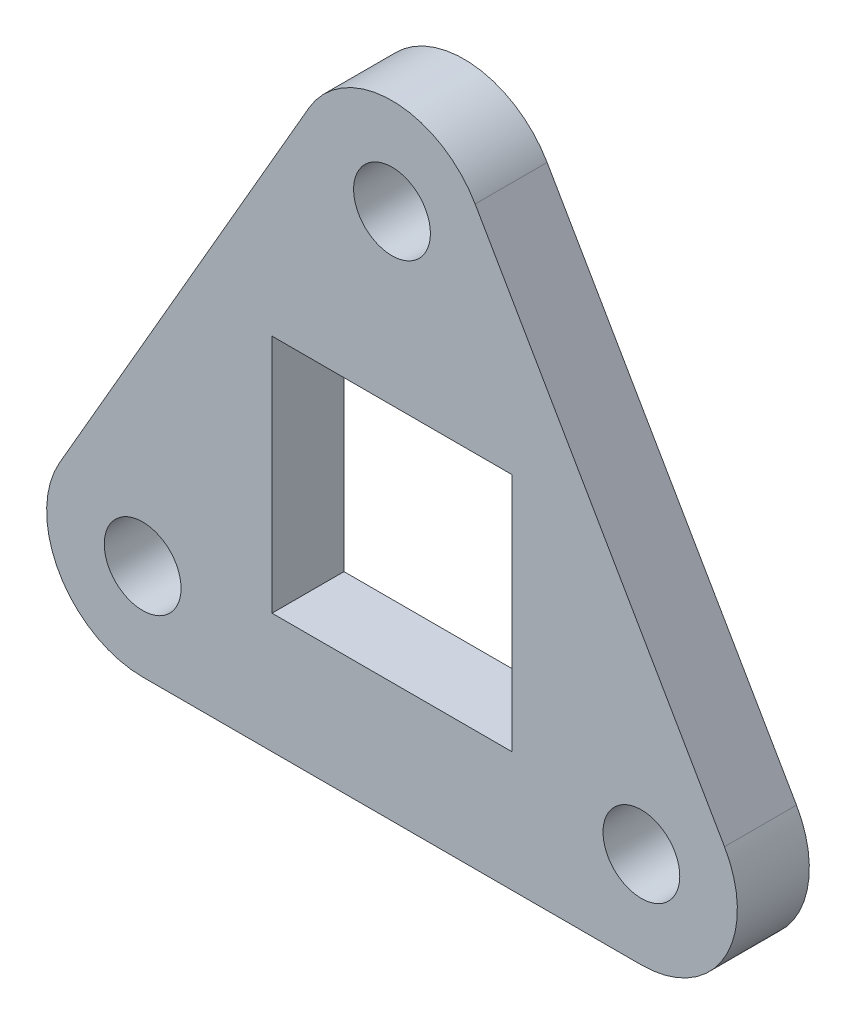
ISO-10303-21;
HEADER;
FILE_DESCRIPTION(('STEP AP214'),'2;1');
FILE_NAME('part.step','',(''),(''),'','','');
FILE_SCHEMA(('AUTOMOTIVE_DESIGN { 1 0 10303 214 1 1 1 1 }'));
ENDSEC;
DATA;
#1=APPLICATION_CONTEXT('core data for automotive mechanical design processes');
#2=APPLICATION_PROTOCOL_DEFINITION('international standard','automotive_design',2000,#1);
#3=PRODUCT_CONTEXT('',#1,'mechanical');
#4=PRODUCT('Part','Part','',(#3));
#5=PRODUCT_RELATED_PRODUCT_CATEGORY('part','',(#4));
#6=PRODUCT_DEFINITION_FORMATION('','',#4);
#7=PRODUCT_DEFINITION_CONTEXT('part definition',#1,'design');
#8=PRODUCT_DEFINITION('design','',#6,#7);
#9=PRODUCT_DEFINITION_SHAPE('','',#8);
#10=(LENGTH_UNIT() NAMED_UNIT(*) SI_UNIT(.MILLI.,.METRE.));
#11=(NAMED_UNIT(*) PLANE_ANGLE_UNIT() SI_UNIT($,.RADIAN.));
#12=(NAMED_UNIT(*) SI_UNIT($,.STERADIAN.) SOLID_ANGLE_UNIT());
#13=UNCERTAINTY_MEASURE_WITH_UNIT(LENGTH_MEASURE(1.E-05),#10,'distance_accuracy_value','');
#14=(GEOMETRIC_REPRESENTATION_CONTEXT(3) GLOBAL_UNCERTAINTY_ASSIGNED_CONTEXT((#13)) GLOBAL_UNIT_ASSIGNED_CONTEXT((#10,
#11,#12)) REPRESENTATION_CONTEXT('',''));
#15=CARTESIAN_POINT('',(0.,0.,0.));
#16=DIRECTION('',(0.,0.,1.));
#17=DIRECTION('',(1.,0.,0.));
#18=AXIS2_PLACEMENT_3D('',#15,#16,#17);
#19=CARTESIAN_POINT('',(0.,12.,3.));
#20=DIRECTION('',(0.,0.,-1.));
#21=DIRECTION('',(-1.,0.,0.));
#22=AXIS2_PLACEMENT_3D('',#19,#20,#21);
#23=PLANE('',#22);
#24=CARTESIAN_POINT('',(0.,12.,3.));
#25=DIRECTION('',(0.,0.,1.));
#26=DIRECTION('',(-1.,0.,0.));
#27=AXIS2_PLACEMENT_3D('',#24,#25,#26);
#28=CIRCLE('',#27,4.);
#29=CARTESIAN_POINT('',(3.46410161513776,14.,3.));
#30=VERTEX_POINT('',#29);
#31=CARTESIAN_POINT('',(-3.46410161513774,14.,3.));
#32=VERTEX_POINT('',#31);
#33=EDGE_CURVE('E149',#30,#32,#28,.T.);
#34=ORIENTED_EDGE('',*,*,#33,.T.);
#35=DIRECTION('',(-0.500000000000004,-0.866025403784436,0.));
#36=VECTOR('',#35,1.);
#37=CARTESIAN_POINT('',(-13.8564064605511,-3.99999999999989,3.));
#38=LINE('',#37,#36);
#39=CARTESIAN_POINT('',(-13.8564064605511,-3.99999999999987,3.));
#40=VERTEX_POINT('',#39);
#41=EDGE_CURVE('E152',#32,#40,#38,.T.);
#42=ORIENTED_EDGE('',*,*,#41,.T.);
#43=CARTESIAN_POINT('',(-10.3923048454133,-5.9999999999999,3.));
#44=DIRECTION('',(0.,0.,1.));
#45=DIRECTION('',(1.,0.,0.));
#46=AXIS2_PLACEMENT_3D('',#43,#44,#45);
#47=CIRCLE('',#46,4.00000000000004);
#48=CARTESIAN_POINT('',(-10.3923048454133,-9.99999999999999,3.));
#49=VERTEX_POINT('',#48);
#50=EDGE_CURVE('E155',#40,#49,#47,.T.);
#51=ORIENTED_EDGE('',*,*,#50,.T.);
#52=DIRECTION('',(1.,0.,0.));
#53=VECTOR('',#52,1.);
#54=CARTESIAN_POINT('',(-10.3923048454133,-9.99999999999999,3.));
#55=LINE('',#54,#53);
#56=CARTESIAN_POINT('',(10.3923048454132,-10.,3.));
#57=VERTEX_POINT('',#56);
#58=EDGE_CURVE('E157',#49,#57,#55,.T.);
#59=ORIENTED_EDGE('',*,*,#58,.T.);
#60=CARTESIAN_POINT('',(10.3923048454132,-6.00000000000005,3.));
#61=DIRECTION('',(0.,0.,1.));
#62=DIRECTION('',(1.,0.,0.));
#63=AXIS2_PLACEMENT_3D('',#60,#61,#62);
#64=CIRCLE('',#63,3.99999999999998);
#65=CARTESIAN_POINT('',(13.856406460551,-4.00000000000006,3.));
#66=VERTEX_POINT('',#65);
#67=EDGE_CURVE('E159',#57,#66,#64,.T.);
#68=ORIENTED_EDGE('',*,*,#67,.T.);
#69=DIRECTION('',(-0.499999999999998,0.86602540378444,0.));
#70=VECTOR('',#69,1.);
#71=CARTESIAN_POINT('',(3.46410161513776,14.,3.));
#72=LINE('',#71,#70);
#73=EDGE_CURVE('E161',#66,#30,#72,.T.);
#74=ORIENTED_EDGE('',*,*,#73,.T.);
#75=EDGE_LOOP('',(#34,#42,#51,#59,#68,#74));
#76=FACE_BOUND('',#75,.T.);
#77=DIRECTION('',(0.,-1.,0.));
#78=VECTOR('',#77,1.);
#79=CARTESIAN_POINT('',(-5.,-5.,3.));
#80=LINE('',#79,#78);
#81=CARTESIAN_POINT('',(-5.,5.,3.));
#82=VERTEX_POINT('',#81);
#83=CARTESIAN_POINT('',(-5.,-5.,3.));
#84=VERTEX_POINT('',#83);
#85=EDGE_CURVE('E110',#82,#84,#80,.T.);
#86=ORIENTED_EDGE('',*,*,#85,.F.);
#87=DIRECTION('',(-1.,0.,0.));
#88=VECTOR('',#87,1.);
#89=CARTESIAN_POINT('',(5.,5.,3.));
#90=LINE('',#89,#88);
#91=CARTESIAN_POINT('',(5.,5.,3.));
#92=VERTEX_POINT('',#91);
#93=EDGE_CURVE('E133',#92,#82,#90,.T.);
#94=ORIENTED_EDGE('',*,*,#93,.F.);
#95=DIRECTION('',(0.,1.,0.));
#96=VECTOR('',#95,1.);
#97=CARTESIAN_POINT('',(5.,-5.,3.));
#98=LINE('',#97,#96);
#99=CARTESIAN_POINT('',(5.,-5.,3.));
#100=VERTEX_POINT('',#99);
#101=EDGE_CURVE('E131',#100,#92,#98,.T.);
#102=ORIENTED_EDGE('',*,*,#101,.F.);
#103=DIRECTION('',(1.,0.,0.));
#104=VECTOR('',#103,1.);
#105=CARTESIAN_POINT('',(5.,-5.,3.));
#106=LINE('',#105,#104);
#107=EDGE_CURVE('E118',#84,#100,#106,.T.);
#108=ORIENTED_EDGE('',*,*,#107,.F.);
#109=EDGE_LOOP('',(#86,#94,#102,#108));
#110=FACE_BOUND('',#109,.T.);
#111=CARTESIAN_POINT('',(0.,12.,3.));
#112=DIRECTION('',(0.,0.,1.));
#113=DIRECTION('',(1.,0.,0.));
#114=AXIS2_PLACEMENT_3D('',#111,#112,#113);
#115=CIRCLE('',#114,1.6);
#116=CARTESIAN_POINT('',(1.6,12.,3.));
#117=VERTEX_POINT('',#116);
#118=EDGE_CURVE('E139',#117,#117,#115,.T.);
#119=ORIENTED_EDGE('',*,*,#118,.F.);
#120=EDGE_LOOP('',(#119));
#121=FACE_BOUND('',#120,.T.);
#122=CARTESIAN_POINT('',(10.3923048454132,-6.00000000000005,3.));
#123=DIRECTION('',(0.,0.,1.));
#124=DIRECTION('',(1.,0.,0.));
#125=AXIS2_PLACEMENT_3D('',#122,#123,#124);
#126=CIRCLE('',#125,1.6);
#127=CARTESIAN_POINT('',(11.9923048454132,-6.00000000000005,3.));
#128=VERTEX_POINT('',#127);
#129=EDGE_CURVE('E267',#128,#128,#126,.T.);
#130=ORIENTED_EDGE('',*,*,#129,.F.);
#131=EDGE_LOOP('',(#130));
#132=FACE_BOUND('',#131,.T.);
#133=CARTESIAN_POINT('',(-10.3923048454133,-5.9999999999999,3.));
#134=DIRECTION('',(0.,0.,1.));
#135=DIRECTION('',(1.,0.,0.));
#136=AXIS2_PLACEMENT_3D('',#133,#134,#135);
#137=CIRCLE('',#136,1.6);
#138=CARTESIAN_POINT('',(-8.79230484541331,-5.9999999999999,3.));
#139=VERTEX_POINT('',#138);
#140=EDGE_CURVE('E258',#139,#139,#137,.T.);
#141=ORIENTED_EDGE('',*,*,#140,.F.);
#142=EDGE_LOOP('',(#141));
#143=FACE_BOUND('',#142,.T.);
#144=ADVANCED_FACE('F33',(#76,#110,#121,#132,#143),#23,.F.);
#145=CARTESIAN_POINT('',(0.,12.,0.));
#146=DIRECTION('',(0.,0.,-1.));
#147=DIRECTION('',(-1.,0.,0.));
#148=AXIS2_PLACEMENT_3D('',#145,#146,#147);
#149=PLANE('',#148);
#150=CARTESIAN_POINT('',(10.3923048454132,-6.00000000000005,0.));
#151=DIRECTION('',(0.,0.,1.));
#152=DIRECTION('',(1.,0.,0.));
#153=AXIS2_PLACEMENT_3D('',#150,#151,#152);
#154=CIRCLE('',#153,1.6);
#155=CARTESIAN_POINT('',(11.9923048454132,-6.00000000000005,0.));
#156=VERTEX_POINT('',#155);
#157=EDGE_CURVE('E264',#156,#156,#154,.T.);
#158=ORIENTED_EDGE('',*,*,#157,.T.);
#159=EDGE_LOOP('',(#158));
#160=FACE_BOUND('',#159,.T.);
#161=DIRECTION('',(-1.,0.,0.));
#162=VECTOR('',#161,1.);
#163=CARTESIAN_POINT('',(5.,5.,0.));
#164=LINE('',#163,#162);
#165=CARTESIAN_POINT('',(5.,5.,0.));
#166=VERTEX_POINT('',#165);
#167=CARTESIAN_POINT('',(-5.,5.,0.));
#168=VERTEX_POINT('',#167);
#169=EDGE_CURVE('E119',#166,#168,#164,.T.);
#170=ORIENTED_EDGE('',*,*,#169,.T.);
#171=DIRECTION('',(0.,-1.,0.));
#172=VECTOR('',#171,1.);
#173=CARTESIAN_POINT('',(-5.,-5.,0.));
#174=LINE('',#173,#172);
#175=CARTESIAN_POINT('',(-5.,-5.,0.));
#176=VERTEX_POINT('',#175);
#177=EDGE_CURVE('E56',#168,#176,#174,.T.);
#178=ORIENTED_EDGE('',*,*,#177,.T.);
#179=DIRECTION('',(1.,0.,0.));
#180=VECTOR('',#179,1.);
#181=CARTESIAN_POINT('',(5.,-5.,0.));
#182=LINE('',#181,#180);
#183=CARTESIAN_POINT('',(5.,-5.,0.));
#184=VERTEX_POINT('',#183);
#185=EDGE_CURVE('E125',#176,#184,#182,.T.);
#186=ORIENTED_EDGE('',*,*,#185,.T.);
#187=DIRECTION('',(0.,1.,0.));
#188=VECTOR('',#187,1.);
#189=CARTESIAN_POINT('',(5.,-5.,0.));
#190=LINE('',#189,#188);
#191=EDGE_CURVE('E141',#184,#166,#190,.T.);
#192=ORIENTED_EDGE('',*,*,#191,.T.);
#193=EDGE_LOOP('',(#170,#178,#186,#192));
#194=FACE_BOUND('',#193,.T.);
#195=CARTESIAN_POINT('',(0.,12.,0.));
#196=DIRECTION('',(0.,0.,1.));
#197=DIRECTION('',(-1.,0.,0.));
#198=AXIS2_PLACEMENT_3D('',#195,#196,#197);
#199=CIRCLE('',#198,4.);
#200=CARTESIAN_POINT('',(3.46410161513776,14.,0.));
#201=VERTEX_POINT('',#200);
#202=CARTESIAN_POINT('',(-3.46410161513774,14.,0.));
#203=VERTEX_POINT('',#202);
#204=EDGE_CURVE('E126',#201,#203,#199,.T.);
#205=ORIENTED_EDGE('',*,*,#204,.F.);
#206=DIRECTION('',(-0.499999999999998,0.86602540378444,0.));
#207=VECTOR('',#206,1.);
#208=CARTESIAN_POINT('',(3.46410161513776,14.,0.));
#209=LINE('',#208,#207);
#210=CARTESIAN_POINT('',(13.856406460551,-4.00000000000006,0.));
#211=VERTEX_POINT('',#210);
#212=EDGE_CURVE('E153',#211,#201,#209,.T.);
#213=ORIENTED_EDGE('',*,*,#212,.F.);
#214=CARTESIAN_POINT('',(10.3923048454132,-6.00000000000005,0.));
#215=DIRECTION('',(0.,0.,1.));
#216=DIRECTION('',(1.,0.,0.));
#217=AXIS2_PLACEMENT_3D('',#214,#215,#216);
#218=CIRCLE('',#217,3.99999999999998);
#219=CARTESIAN_POINT('',(10.3923048454132,-10.,0.));
#220=VERTEX_POINT('',#219);
#221=EDGE_CURVE('E172',#220,#211,#218,.T.);
#222=ORIENTED_EDGE('',*,*,#221,.F.);
#223=DIRECTION('',(1.,0.,0.));
#224=VECTOR('',#223,1.);
#225=CARTESIAN_POINT('',(-10.3923048454133,-9.99999999999999,0.));
#226=LINE('',#225,#224);
#227=CARTESIAN_POINT('',(-10.3923048454133,-9.99999999999999,0.));
#228=VERTEX_POINT('',#227);
#229=EDGE_CURVE('E170',#228,#220,#226,.T.);
#230=ORIENTED_EDGE('',*,*,#229,.F.);
#231=CARTESIAN_POINT('',(-10.3923048454133,-5.9999999999999,0.));
#232=DIRECTION('',(0.,0.,1.));
#233=DIRECTION('',(1.,0.,0.));
#234=AXIS2_PLACEMENT_3D('',#231,#232,#233);
#235=CIRCLE('',#234,4.00000000000004);
#236=CARTESIAN_POINT('',(-13.8564064605511,-3.99999999999987,0.));
#237=VERTEX_POINT('',#236);
#238=EDGE_CURVE('E168',#237,#228,#235,.T.);
#239=ORIENTED_EDGE('',*,*,#238,.F.);
#240=DIRECTION('',(-0.500000000000004,-0.866025403784436,0.));
#241=VECTOR('',#240,1.);
#242=CARTESIAN_POINT('',(-13.8564064605511,-3.99999999999989,0.));
#243=LINE('',#242,#241);
#244=EDGE_CURVE('E166',#203,#237,#243,.T.);
#245=ORIENTED_EDGE('',*,*,#244,.F.);
#246=EDGE_LOOP('',(#205,#213,#222,#230,#239,#245));
#247=FACE_BOUND('',#246,.T.);
#248=CARTESIAN_POINT('',(0.,12.,0.));
#249=DIRECTION('',(0.,0.,1.));
#250=DIRECTION('',(1.,0.,0.));
#251=AXIS2_PLACEMENT_3D('',#248,#249,#250);
#252=CIRCLE('',#251,1.6);
#253=CARTESIAN_POINT('',(1.6,12.,0.));
#254=VERTEX_POINT('',#253);
#255=EDGE_CURVE('E270',#254,#254,#252,.T.);
#256=ORIENTED_EDGE('',*,*,#255,.T.);
#257=EDGE_LOOP('',(#256));
#258=FACE_BOUND('',#257,.T.);
#259=CARTESIAN_POINT('',(-10.3923048454133,-5.9999999999999,0.));
#260=DIRECTION('',(0.,0.,1.));
#261=DIRECTION('',(1.,0.,0.));
#262=AXIS2_PLACEMENT_3D('',#259,#260,#261);
#263=CIRCLE('',#262,1.6);
#264=CARTESIAN_POINT('',(-8.79230484541331,-5.9999999999999,0.));
#265=VERTEX_POINT('',#264);
#266=EDGE_CURVE('E261',#265,#265,#263,.T.);
#267=ORIENTED_EDGE('',*,*,#266,.T.);
#268=EDGE_LOOP('',(#267));
#269=FACE_BOUND('',#268,.T.);
#270=ADVANCED_FACE('F196',(#160,#194,#247,#258,#269),#149,.T.);
#271=CARTESIAN_POINT('',(0.,12.,3.));
#272=DIRECTION('',(0.,0.,-1.));
#273=DIRECTION('',(-1.,0.,0.));
#274=AXIS2_PLACEMENT_3D('',#271,#272,#273);
#275=CYLINDRICAL_SURFACE('',#274,4.);
#276=ORIENTED_EDGE('',*,*,#204,.T.);
#277=DIRECTION('',(0.,0.,-1.));
#278=VECTOR('',#277,1.);
#279=CARTESIAN_POINT('',(-3.46410161513774,14.,3.));
#280=LINE('',#279,#278);
#281=EDGE_CURVE('E11',#32,#203,#280,.T.);
#282=ORIENTED_EDGE('',*,*,#281,.F.);
#283=ORIENTED_EDGE('',*,*,#33,.F.);
#284=DIRECTION('',(0.,0.,-1.));
#285=VECTOR('',#284,1.);
#286=CARTESIAN_POINT('',(3.46410161513776,14.,3.));
#287=LINE('',#286,#285);
#288=EDGE_CURVE('E163',#30,#201,#287,.T.);
#289=ORIENTED_EDGE('',*,*,#288,.T.);
#290=EDGE_LOOP('',(#276,#282,#283,#289));
#291=FACE_BOUND('',#290,.T.);
#292=ADVANCED_FACE('F35',(#291),#275,.T.);
#293=CARTESIAN_POINT('',(-13.8564064605511,-3.99999999999989,3.));
#294=DIRECTION('',(0.866025403784436,-0.500000000000004,0.));
#295=DIRECTION('',(0.500000000000004,0.866025403784437,0.));
#296=AXIS2_PLACEMENT_3D('',#293,#294,#295);
#297=PLANE('',#296);
#298=ORIENTED_EDGE('',*,*,#244,.T.);
#299=DIRECTION('',(0.,0.,-1.));
#300=VECTOR('',#299,1.);
#301=CARTESIAN_POINT('',(-13.8564064605511,-3.99999999999987,3.));
#302=LINE('',#301,#300);
#303=EDGE_CURVE('E41',#40,#237,#302,.T.);
#304=ORIENTED_EDGE('',*,*,#303,.F.);
#305=ORIENTED_EDGE('',*,*,#41,.F.);
#306=ORIENTED_EDGE('',*,*,#281,.T.);
#307=EDGE_LOOP('',(#298,#304,#305,#306));
#308=FACE_BOUND('',#307,.T.);
#309=ADVANCED_FACE('F213',(#308),#297,.F.);
#310=CARTESIAN_POINT('',(-10.3923048454133,-5.9999999999999,3.));
#311=DIRECTION('',(0.,0.,-1.));
#312=DIRECTION('',(-1.,0.,0.));
#313=AXIS2_PLACEMENT_3D('',#310,#311,#312);
#314=CYLINDRICAL_SURFACE('',#313,4.00000000000004);
#315=ORIENTED_EDGE('',*,*,#238,.T.);
#316=DIRECTION('',(0.,0.,-1.));
#317=VECTOR('',#316,1.);
#318=CARTESIAN_POINT('',(-10.3923048454133,-9.99999999999999,3.));
#319=LINE('',#318,#317);
#320=EDGE_CURVE('E183',#49,#228,#319,.T.);
#321=ORIENTED_EDGE('',*,*,#320,.F.);
#322=ORIENTED_EDGE('',*,*,#50,.F.);
#323=ORIENTED_EDGE('',*,*,#303,.T.);
#324=EDGE_LOOP('',(#315,#321,#322,#323));
#325=FACE_BOUND('',#324,.T.);
#326=ADVANCED_FACE('F190',(#325),#314,.T.);
#327=CARTESIAN_POINT('',(-10.3923048454133,-9.99999999999999,3.));
#328=DIRECTION('',(0.,1.,0.));
#329=DIRECTION('',(-1.,0.,0.));
#330=AXIS2_PLACEMENT_3D('',#327,#328,#329);
#331=PLANE('',#330);
#332=ORIENTED_EDGE('',*,*,#229,.T.);
#333=DIRECTION('',(0.,0.,-1.));
#334=VECTOR('',#333,1.);
#335=CARTESIAN_POINT('',(10.3923048454132,-10.,3.));
#336=LINE('',#335,#334);
#337=EDGE_CURVE('E180',#57,#220,#336,.T.);
#338=ORIENTED_EDGE('',*,*,#337,.F.);
#339=ORIENTED_EDGE('',*,*,#58,.F.);
#340=ORIENTED_EDGE('',*,*,#320,.T.);
#341=EDGE_LOOP('',(#332,#338,#339,#340));
#342=FACE_BOUND('',#341,.T.);
#343=ADVANCED_FACE('F202',(#342),#331,.F.);
#344=CARTESIAN_POINT('',(10.3923048454132,-6.00000000000005,3.));
#345=DIRECTION('',(0.,0.,-1.));
#346=DIRECTION('',(-1.,0.,0.));
#347=AXIS2_PLACEMENT_3D('',#344,#345,#346);
#348=CYLINDRICAL_SURFACE('',#347,3.99999999999998);
#349=ORIENTED_EDGE('',*,*,#221,.T.);
#350=DIRECTION('',(0.,0.,-1.));
#351=VECTOR('',#350,1.);
#352=CARTESIAN_POINT('',(13.856406460551,-4.00000000000006,3.));
#353=LINE('',#352,#351);
#354=EDGE_CURVE('E177',#66,#211,#353,.T.);
#355=ORIENTED_EDGE('',*,*,#354,.F.);
#356=ORIENTED_EDGE('',*,*,#67,.F.);
#357=ORIENTED_EDGE('',*,*,#337,.T.);
#358=EDGE_LOOP('',(#349,#355,#356,#357));
#359=FACE_BOUND('',#358,.T.);
#360=ADVANCED_FACE('F206',(#359),#348,.T.);
#361=CARTESIAN_POINT('',(3.46410161513776,14.,3.));
#362=DIRECTION('',(-0.86602540378444,-0.499999999999998,0.));
#363=DIRECTION('',(0.499999999999998,-0.86602540378444,0.));
#364=AXIS2_PLACEMENT_3D('',#361,#362,#363);
#365=PLANE('',#364);
#366=ORIENTED_EDGE('',*,*,#212,.T.);
#367=ORIENTED_EDGE('',*,*,#288,.F.);
#368=ORIENTED_EDGE('',*,*,#73,.F.);
#369=ORIENTED_EDGE('',*,*,#354,.T.);
#370=EDGE_LOOP('',(#366,#367,#368,#369));
#371=FACE_BOUND('',#370,.T.);
#372=ADVANCED_FACE('F216',(#371),#365,.F.);
#373=CARTESIAN_POINT('',(-5.,-5.,3.));
#374=DIRECTION('',(1.,0.,0.));
#375=DIRECTION('',(0.,0.,-1.));
#376=AXIS2_PLACEMENT_3D('',#373,#374,#375);
#377=PLANE('',#376);
#378=ORIENTED_EDGE('',*,*,#177,.F.);
#379=DIRECTION('',(0.,0.,-1.));
#380=VECTOR('',#379,1.);
#381=CARTESIAN_POINT('',(-5.,5.,3.));
#382=LINE('',#381,#380);
#383=EDGE_CURVE('E114',#82,#168,#382,.T.);
#384=ORIENTED_EDGE('',*,*,#383,.F.);
#385=ORIENTED_EDGE('',*,*,#85,.T.);
#386=DIRECTION('',(0.,0.,-1.));
#387=VECTOR('',#386,1.);
#388=CARTESIAN_POINT('',(-5.,-5.,3.));
#389=LINE('',#388,#387);
#390=EDGE_CURVE('E113',#84,#176,#389,.T.);
#391=ORIENTED_EDGE('',*,*,#390,.T.);
#392=EDGE_LOOP('',(#378,#384,#385,#391));
#393=FACE_BOUND('',#392,.T.);
#394=ADVANCED_FACE('F112',(#393),#377,.T.);
#395=CARTESIAN_POINT('',(5.,-5.,3.));
#396=DIRECTION('',(0.,1.,0.));
#397=DIRECTION('',(-1.,0.,0.));
#398=AXIS2_PLACEMENT_3D('',#395,#396,#397);
#399=PLANE('',#398);
#400=ORIENTED_EDGE('',*,*,#185,.F.);
#401=ORIENTED_EDGE('',*,*,#390,.F.);
#402=ORIENTED_EDGE('',*,*,#107,.T.);
#403=DIRECTION('',(0.,0.,-1.));
#404=VECTOR('',#403,1.);
#405=CARTESIAN_POINT('',(5.,-5.,3.));
#406=LINE('',#405,#404);
#407=EDGE_CURVE('E127',#100,#184,#406,.T.);
#408=ORIENTED_EDGE('',*,*,#407,.T.);
#409=EDGE_LOOP('',(#400,#401,#402,#408));
#410=FACE_BOUND('',#409,.T.);
#411=ADVANCED_FACE('F122',(#410),#399,.T.);
#412=CARTESIAN_POINT('',(5.,-5.,3.));
#413=DIRECTION('',(-1.,0.,0.));
#414=DIRECTION('',(0.,0.,1.));
#415=AXIS2_PLACEMENT_3D('',#412,#413,#414);
#416=PLANE('',#415);
#417=ORIENTED_EDGE('',*,*,#191,.F.);
#418=ORIENTED_EDGE('',*,*,#407,.F.);
#419=ORIENTED_EDGE('',*,*,#101,.T.);
#420=DIRECTION('',(0.,0.,-1.));
#421=VECTOR('',#420,1.);
#422=CARTESIAN_POINT('',(5.,5.,3.));
#423=LINE('',#422,#421);
#424=EDGE_CURVE('E48',#92,#166,#423,.T.);
#425=ORIENTED_EDGE('',*,*,#424,.T.);
#426=EDGE_LOOP('',(#417,#418,#419,#425));
#427=FACE_BOUND('',#426,.T.);
#428=ADVANCED_FACE('F235',(#427),#416,.T.);
#429=CARTESIAN_POINT('',(5.,5.,3.));
#430=DIRECTION('',(0.,-1.,0.));
#431=DIRECTION('',(1.,0.,0.));
#432=AXIS2_PLACEMENT_3D('',#429,#430,#431);
#433=PLANE('',#432);
#434=ORIENTED_EDGE('',*,*,#169,.F.);
#435=ORIENTED_EDGE('',*,*,#424,.F.);
#436=ORIENTED_EDGE('',*,*,#93,.T.);
#437=ORIENTED_EDGE('',*,*,#383,.T.);
#438=EDGE_LOOP('',(#434,#435,#436,#437));
#439=FACE_BOUND('',#438,.T.);
#440=ADVANCED_FACE('F238',(#439),#433,.T.);
#441=CARTESIAN_POINT('',(0.,12.,3.));
#442=DIRECTION('',(0.,0.,-1.));
#443=DIRECTION('',(-1.,0.,0.));
#444=AXIS2_PLACEMENT_3D('',#441,#442,#443);
#445=CYLINDRICAL_SURFACE('',#444,1.6);
#446=ORIENTED_EDGE('',*,*,#118,.T.);
#447=EDGE_LOOP('',(#446));
#448=FACE_BOUND('',#447,.T.);
#449=ORIENTED_EDGE('',*,*,#255,.F.);
#450=EDGE_LOOP('',(#449));
#451=FACE_BOUND('',#450,.T.);
#452=ADVANCED_FACE('F242',(#448,#451),#445,.F.);
#453=CARTESIAN_POINT('',(10.3923048454132,-6.00000000000005,3.));
#454=DIRECTION('',(0.,0.,-1.));
#455=DIRECTION('',(-1.,0.,0.));
#456=AXIS2_PLACEMENT_3D('',#453,#454,#455);
#457=CYLINDRICAL_SURFACE('',#456,1.6);
#458=ORIENTED_EDGE('',*,*,#129,.T.);
#459=EDGE_LOOP('',(#458));
#460=FACE_BOUND('',#459,.T.);
#461=ORIENTED_EDGE('',*,*,#157,.F.);
#462=EDGE_LOOP('',(#461));
#463=FACE_BOUND('',#462,.T.);
#464=ADVANCED_FACE('F245',(#460,#463),#457,.F.);
#465=CARTESIAN_POINT('',(-10.3923048454133,-5.9999999999999,3.));
#466=DIRECTION('',(0.,0.,-1.));
#467=DIRECTION('',(-1.,0.,0.));
#468=AXIS2_PLACEMENT_3D('',#465,#466,#467);
#469=CYLINDRICAL_SURFACE('',#468,1.6);
#470=ORIENTED_EDGE('',*,*,#140,.T.);
#471=EDGE_LOOP('',(#470));
#472=FACE_BOUND('',#471,.T.);
#473=ORIENTED_EDGE('',*,*,#266,.F.);
#474=EDGE_LOOP('',(#473));
#475=FACE_BOUND('',#474,.T.);
#476=ADVANCED_FACE('F249',(#472,#475),#469,.F.);
#477=CLOSED_SHELL('',(#144,#270,#292,#309,#326,#343,#360,#372,#394,#411,#428,#440,#452,#464,#476));
#478=MANIFOLD_SOLID_BREP('B2',#477);
#479=ADVANCED_BREP_SHAPE_REPRESENTATION('',(#18,#478),#14);
#480=SHAPE_DEFINITION_REPRESENTATION(#9,#479);
ENDSEC;
END-ISO-10303-21;
